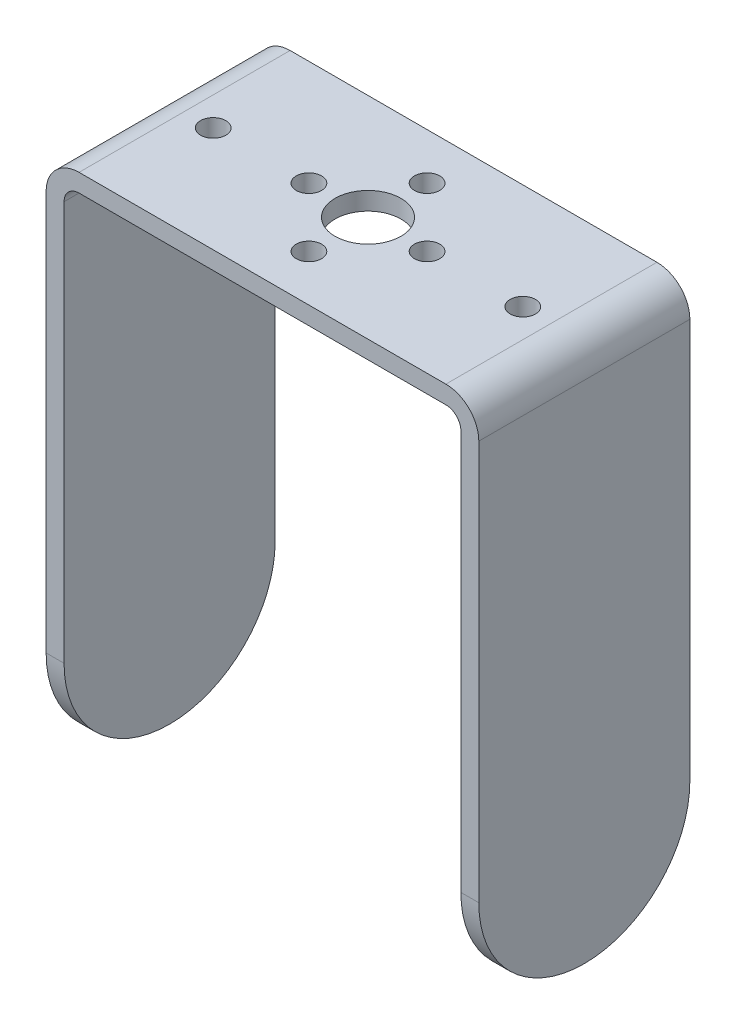
ISO-10303-21;
HEADER;
FILE_DESCRIPTION(('STEP AP214'),'2;1');
FILE_NAME('part.step','',(''),(''),'','','');
FILE_SCHEMA(('AUTOMOTIVE_DESIGN { 1 0 10303 214 1 1 1 1 }'));
ENDSEC;
DATA;
#1=APPLICATION_CONTEXT('core data for automotive mechanical design processes');
#2=APPLICATION_PROTOCOL_DEFINITION('international standard','automotive_design',2000,#1);
#3=PRODUCT_CONTEXT('',#1,'mechanical');
#4=PRODUCT('Part','Part','',(#3));
#5=PRODUCT_RELATED_PRODUCT_CATEGORY('part','',(#4));
#6=PRODUCT_DEFINITION_FORMATION('','',#4);
#7=PRODUCT_DEFINITION_CONTEXT('part definition',#1,'design');
#8=PRODUCT_DEFINITION('design','',#6,#7);
#9=PRODUCT_DEFINITION_SHAPE('','',#8);
#10=(LENGTH_UNIT() NAMED_UNIT(*) SI_UNIT(.MILLI.,.METRE.));
#11=(NAMED_UNIT(*) PLANE_ANGLE_UNIT() SI_UNIT($,.RADIAN.));
#12=(NAMED_UNIT(*) SI_UNIT($,.STERADIAN.) SOLID_ANGLE_UNIT());
#13=UNCERTAINTY_MEASURE_WITH_UNIT(LENGTH_MEASURE(1.E-05),#10,'distance_accuracy_value','');
#14=(GEOMETRIC_REPRESENTATION_CONTEXT(3) GLOBAL_UNCERTAINTY_ASSIGNED_CONTEXT((#13)) GLOBAL_UNIT_ASSIGNED_CONTEXT((#10,
#11,#12)) REPRESENTATION_CONTEXT('',''));
#15=CARTESIAN_POINT('',(0.,0.,0.));
#16=DIRECTION('',(0.,0.,1.));
#17=DIRECTION('',(1.,0.,0.));
#18=AXIS2_PLACEMENT_3D('',#15,#16,#17);
#19=CARTESIAN_POINT('',(23.876,-3.96240000000003,12.7));
#20=DIRECTION('',(1.,0.,0.));
#21=DIRECTION('',(0.,0.,-1.));
#22=AXIS2_PLACEMENT_3D('',#19,#20,#21);
#23=PLANE('',#22);
#24=DIRECTION('',(0.,1.,0.));
#25=VECTOR('',#24,1.);
#26=CARTESIAN_POINT('',(23.876,-3.96240000000003,-12.7));
#27=LINE('',#26,#25);
#28=CARTESIAN_POINT('',(23.876,-3.96240000000003,-12.7));
#29=VERTEX_POINT('',#28);
#30=CARTESIAN_POINT('',(23.876,-52.07,-12.7));
#31=VERTEX_POINT('',#30);
#32=EDGE_CURVE('E188',#29,#31,#27,.F.);
#33=ORIENTED_EDGE('',*,*,#32,.T.);
#34=CARTESIAN_POINT('',(23.876,-52.07,0.));
#35=DIRECTION('',(1.,0.,0.));
#36=DIRECTION('',(0.,0.,-1.));
#37=AXIS2_PLACEMENT_3D('',#34,#35,#36);
#38=CIRCLE('',#37,12.7);
#39=CARTESIAN_POINT('',(23.876,-64.77,0.));
#40=VERTEX_POINT('',#39);
#41=EDGE_CURVE('E235',#31,#40,#38,.F.);
#42=ORIENTED_EDGE('',*,*,#41,.T.);
#43=CARTESIAN_POINT('',(23.876,-52.07,0.));
#44=DIRECTION('',(1.,0.,0.));
#45=DIRECTION('',(0.,0.,-1.));
#46=AXIS2_PLACEMENT_3D('',#43,#44,#45);
#47=CIRCLE('',#46,12.7);
#48=CARTESIAN_POINT('',(23.876,-52.07,12.7));
#49=VERTEX_POINT('',#48);
#50=EDGE_CURVE('E233',#40,#49,#47,.F.);
#51=ORIENTED_EDGE('',*,*,#50,.T.);
#52=DIRECTION('',(0.,1.,0.));
#53=VECTOR('',#52,1.);
#54=CARTESIAN_POINT('',(23.876,-3.96240000000003,12.7));
#55=LINE('',#54,#53);
#56=CARTESIAN_POINT('',(23.876,-3.96240000000003,12.7));
#57=VERTEX_POINT('',#56);
#58=EDGE_CURVE('E166',#57,#49,#55,.F.);
#59=ORIENTED_EDGE('',*,*,#58,.F.);
#60=DIRECTION('',(0.,0.,-1.));
#61=VECTOR('',#60,1.);
#62=CARTESIAN_POINT('',(23.876,-3.96240000000003,12.7));
#63=LINE('',#62,#61);
#64=EDGE_CURVE('E187',#57,#29,#63,.T.);
#65=ORIENTED_EDGE('',*,*,#64,.T.);
#66=EDGE_LOOP('',(#33,#42,#51,#59,#65));
#67=FACE_BOUND('',#66,.T.);
#68=ADVANCED_FACE('F41',(#67),#23,.F.);
#69=CARTESIAN_POINT('',(26.035,-3.96240000000003,12.7));
#70=DIRECTION('',(1.,0.,0.));
#71=DIRECTION('',(0.,0.,-1.));
#72=AXIS2_PLACEMENT_3D('',#69,#70,#71);
#73=PLANE('',#72);
#74=CARTESIAN_POINT('',(26.035,-52.07,0.));
#75=DIRECTION('',(1.,0.,0.));
#76=DIRECTION('',(0.,0.,-1.));
#77=AXIS2_PLACEMENT_3D('',#74,#75,#76);
#78=CIRCLE('',#77,12.7);
#79=CARTESIAN_POINT('',(26.035,-52.07,12.7));
#80=VERTEX_POINT('',#79);
#81=CARTESIAN_POINT('',(26.035,-64.77,0.));
#82=VERTEX_POINT('',#81);
#83=EDGE_CURVE('E237',#80,#82,#78,.T.);
#84=ORIENTED_EDGE('',*,*,#83,.T.);
#85=CARTESIAN_POINT('',(26.035,-52.07,0.));
#86=DIRECTION('',(1.,0.,0.));
#87=DIRECTION('',(0.,0.,-1.));
#88=AXIS2_PLACEMENT_3D('',#85,#86,#87);
#89=CIRCLE('',#88,12.7);
#90=CARTESIAN_POINT('',(26.035,-52.07,-12.7));
#91=VERTEX_POINT('',#90);
#92=EDGE_CURVE('E239',#82,#91,#89,.T.);
#93=ORIENTED_EDGE('',*,*,#92,.T.);
#94=DIRECTION('',(0.,-1.,0.));
#95=VECTOR('',#94,1.);
#96=CARTESIAN_POINT('',(26.035,-3.96240000000003,-12.7));
#97=LINE('',#96,#95);
#98=CARTESIAN_POINT('',(26.035,-3.96240000000003,-12.7));
#99=VERTEX_POINT('',#98);
#100=EDGE_CURVE('E149',#99,#91,#97,.T.);
#101=ORIENTED_EDGE('',*,*,#100,.F.);
#102=DIRECTION('',(0.,0.,-1.));
#103=VECTOR('',#102,1.);
#104=CARTESIAN_POINT('',(26.035,-3.96240000000003,12.7));
#105=LINE('',#104,#103);
#106=CARTESIAN_POINT('',(26.035,-3.96240000000003,12.7));
#107=VERTEX_POINT('',#106);
#108=EDGE_CURVE('E143',#107,#99,#105,.T.);
#109=ORIENTED_EDGE('',*,*,#108,.F.);
#110=DIRECTION('',(0.,-1.,0.));
#111=VECTOR('',#110,1.);
#112=CARTESIAN_POINT('',(26.035,-3.96240000000003,12.7));
#113=LINE('',#112,#111);
#114=EDGE_CURVE('E146',#107,#80,#113,.T.);
#115=ORIENTED_EDGE('',*,*,#114,.T.);
#116=EDGE_LOOP('',(#84,#93,#101,#109,#115));
#117=FACE_BOUND('',#116,.T.);
#118=ADVANCED_FACE('F145',(#117),#73,.T.);
#119=CARTESIAN_POINT('',(22.0726,-3.9624,12.7));
#120=DIRECTION('',(0.,0.,-1.));
#121=DIRECTION('',(-1.,0.,0.));
#122=AXIS2_PLACEMENT_3D('',#119,#120,#121);
#123=CYLINDRICAL_SURFACE('',#122,3.9624);
#124=CARTESIAN_POINT('',(22.0726,-3.9624,-12.7));
#125=DIRECTION('',(0.,0.,-1.));
#126=DIRECTION('',(-1.,0.,0.));
#127=AXIS2_PLACEMENT_3D('',#124,#125,#126);
#128=CIRCLE('',#127,3.9624);
#129=CARTESIAN_POINT('',(22.0726,0.,-12.7));
#130=VERTEX_POINT('',#129);
#131=EDGE_CURVE('E193',#130,#99,#128,.T.);
#132=ORIENTED_EDGE('',*,*,#131,.F.);
#133=DIRECTION('',(0.,0.,-1.));
#134=VECTOR('',#133,1.);
#135=CARTESIAN_POINT('',(22.0726,0.,12.7));
#136=LINE('',#135,#134);
#137=CARTESIAN_POINT('',(22.0726,0.,12.7));
#138=VERTEX_POINT('',#137);
#139=EDGE_CURVE('E155',#138,#130,#136,.T.);
#140=ORIENTED_EDGE('',*,*,#139,.F.);
#141=CARTESIAN_POINT('',(22.0726,-3.9624,12.7));
#142=DIRECTION('',(0.,0.,-1.));
#143=DIRECTION('',(-1.,0.,0.));
#144=AXIS2_PLACEMENT_3D('',#141,#142,#143);
#145=CIRCLE('',#144,3.9624);
#146=EDGE_CURVE('E162',#138,#107,#145,.T.);
#147=ORIENTED_EDGE('',*,*,#146,.T.);
#148=ORIENTED_EDGE('',*,*,#108,.T.);
#149=EDGE_LOOP('',(#132,#140,#147,#148));
#150=FACE_BOUND('',#149,.T.);
#151=ADVANCED_FACE('F168',(#150),#123,.T.);
#152=CARTESIAN_POINT('',(-22.0726,0.,12.7));
#153=DIRECTION('',(0.,1.,0.));
#154=DIRECTION('',(0.,0.,1.));
#155=AXIS2_PLACEMENT_3D('',#152,#153,#154);
#156=PLANE('',#155);
#157=CARTESIAN_POINT('',(0.,0.,7.112));
#158=DIRECTION('',(0.,1.,0.));
#159=DIRECTION('',(0.,0.,1.));
#160=AXIS2_PLACEMENT_3D('',#157,#158,#159);
#161=CIRCLE('',#160,1.52399999999999);
#162=CARTESIAN_POINT('',(0.,0.,8.63599999999999));
#163=VERTEX_POINT('',#162);
#164=EDGE_CURVE('E282',#163,#163,#161,.T.);
#165=ORIENTED_EDGE('',*,*,#164,.F.);
#166=EDGE_LOOP('',(#165));
#167=FACE_BOUND('',#166,.T.);
#168=CARTESIAN_POINT('',(0.,0.,-7.112));
#169=DIRECTION('',(0.,1.,0.));
#170=DIRECTION('',(0.,0.,1.));
#171=AXIS2_PLACEMENT_3D('',#168,#169,#170);
#172=CIRCLE('',#171,1.52399999999999);
#173=CARTESIAN_POINT('',(0.,0.,-5.58800000000001));
#174=VERTEX_POINT('',#173);
#175=EDGE_CURVE('E271',#174,#174,#172,.T.);
#176=ORIENTED_EDGE('',*,*,#175,.F.);
#177=EDGE_LOOP('',(#176));
#178=FACE_BOUND('',#177,.T.);
#179=CARTESIAN_POINT('',(-7.112,0.,0.));
#180=DIRECTION('',(0.,1.,0.));
#181=DIRECTION('',(0.,0.,1.));
#182=AXIS2_PLACEMENT_3D('',#179,#180,#181);
#183=CIRCLE('',#182,1.52399999999999);
#184=CARTESIAN_POINT('',(-7.112,0.,1.52399999999999));
#185=VERTEX_POINT('',#184);
#186=EDGE_CURVE('E270',#185,#185,#183,.T.);
#187=ORIENTED_EDGE('',*,*,#186,.F.);
#188=EDGE_LOOP('',(#187));
#189=FACE_BOUND('',#188,.T.);
#190=CARTESIAN_POINT('',(7.112,0.,0.));
#191=DIRECTION('',(0.,1.,0.));
#192=DIRECTION('',(0.,0.,1.));
#193=AXIS2_PLACEMENT_3D('',#190,#191,#192);
#194=CIRCLE('',#193,1.52399999999999);
#195=CARTESIAN_POINT('',(7.112,0.,1.52399999999999));
#196=VERTEX_POINT('',#195);
#197=EDGE_CURVE('E267',#196,#196,#194,.T.);
#198=ORIENTED_EDGE('',*,*,#197,.F.);
#199=EDGE_LOOP('',(#198));
#200=FACE_BOUND('',#199,.T.);
#201=CARTESIAN_POINT('',(18.6309,0.,0.));
#202=DIRECTION('',(0.,1.,0.));
#203=DIRECTION('',(0.,0.,1.));
#204=AXIS2_PLACEMENT_3D('',#201,#202,#203);
#205=CIRCLE('',#204,1.52399999999999);
#206=CARTESIAN_POINT('',(18.6309,0.,1.52399999999999));
#207=VERTEX_POINT('',#206);
#208=EDGE_CURVE('E264',#207,#207,#205,.T.);
#209=ORIENTED_EDGE('',*,*,#208,.F.);
#210=EDGE_LOOP('',(#209));
#211=FACE_BOUND('',#210,.T.);
#212=CARTESIAN_POINT('',(-18.6309,0.,0.));
#213=DIRECTION('',(0.,1.,0.));
#214=DIRECTION('',(0.,0.,1.));
#215=AXIS2_PLACEMENT_3D('',#212,#213,#214);
#216=CIRCLE('',#215,1.52399999999999);
#217=CARTESIAN_POINT('',(-18.6309,0.,1.52399999999998));
#218=VERTEX_POINT('',#217);
#219=EDGE_CURVE('E260',#218,#218,#216,.T.);
#220=ORIENTED_EDGE('',*,*,#219,.F.);
#221=EDGE_LOOP('',(#220));
#222=FACE_BOUND('',#221,.T.);
#223=CARTESIAN_POINT('',(0.,0.,0.));
#224=DIRECTION('',(0.,1.,0.));
#225=DIRECTION('',(0.,0.,1.));
#226=AXIS2_PLACEMENT_3D('',#223,#224,#225);
#227=CIRCLE('',#226,3.9624);
#228=CARTESIAN_POINT('',(0.,0.,3.9624));
#229=VERTEX_POINT('',#228);
#230=EDGE_CURVE('E256',#229,#229,#227,.T.);
#231=ORIENTED_EDGE('',*,*,#230,.F.);
#232=EDGE_LOOP('',(#231));
#233=FACE_BOUND('',#232,.T.);
#234=DIRECTION('',(1.,0.,0.));
#235=VECTOR('',#234,1.);
#236=CARTESIAN_POINT('',(-22.0726,0.,-12.7));
#237=LINE('',#236,#235);
#238=CARTESIAN_POINT('',(-22.0726,0.,-12.7));
#239=VERTEX_POINT('',#238);
#240=EDGE_CURVE('E195',#239,#130,#237,.T.);
#241=ORIENTED_EDGE('',*,*,#240,.F.);
#242=DIRECTION('',(0.,0.,-1.));
#243=VECTOR('',#242,1.);
#244=CARTESIAN_POINT('',(-22.0726,0.,12.7));
#245=LINE('',#244,#243);
#246=CARTESIAN_POINT('',(-22.0726,0.,12.7));
#247=VERTEX_POINT('',#246);
#248=EDGE_CURVE('E225',#247,#239,#245,.T.);
#249=ORIENTED_EDGE('',*,*,#248,.F.);
#250=DIRECTION('',(1.,0.,0.));
#251=VECTOR('',#250,1.);
#252=CARTESIAN_POINT('',(-22.0726,0.,12.7));
#253=LINE('',#252,#251);
#254=EDGE_CURVE('E169',#247,#138,#253,.T.);
#255=ORIENTED_EDGE('',*,*,#254,.T.);
#256=ORIENTED_EDGE('',*,*,#139,.T.);
#257=EDGE_LOOP('',(#241,#249,#255,#256));
#258=FACE_BOUND('',#257,.T.);
#259=ADVANCED_FACE('F339',(#167,#178,#189,#200,#211,#222,#233,#258),#156,.T.);
#260=CARTESIAN_POINT('',(-22.0726,-3.9624,12.7));
#261=DIRECTION('',(0.,0.,-1.));
#262=DIRECTION('',(-1.,0.,0.));
#263=AXIS2_PLACEMENT_3D('',#260,#261,#262);
#264=CYLINDRICAL_SURFACE('',#263,3.9624);
#265=CARTESIAN_POINT('',(-22.0726,-3.9624,-12.7));
#266=DIRECTION('',(0.,0.,-1.));
#267=DIRECTION('',(-1.,0.,0.));
#268=AXIS2_PLACEMENT_3D('',#265,#266,#267);
#269=CIRCLE('',#268,3.9624);
#270=CARTESIAN_POINT('',(-26.035,-3.96240000000003,-12.7));
#271=VERTEX_POINT('',#270);
#272=EDGE_CURVE('E198',#271,#239,#269,.T.);
#273=ORIENTED_EDGE('',*,*,#272,.F.);
#274=DIRECTION('',(0.,0.,-1.));
#275=VECTOR('',#274,1.);
#276=CARTESIAN_POINT('',(-26.035,-3.96240000000003,12.7));
#277=LINE('',#276,#275);
#278=CARTESIAN_POINT('',(-26.035,-3.96240000000003,12.7));
#279=VERTEX_POINT('',#278);
#280=EDGE_CURVE('E222',#279,#271,#277,.T.);
#281=ORIENTED_EDGE('',*,*,#280,.F.);
#282=CARTESIAN_POINT('',(-22.0726,-3.9624,12.7));
#283=DIRECTION('',(0.,0.,-1.));
#284=DIRECTION('',(-1.,0.,0.));
#285=AXIS2_PLACEMENT_3D('',#282,#283,#284);
#286=CIRCLE('',#285,3.9624);
#287=EDGE_CURVE('E171',#279,#247,#286,.T.);
#288=ORIENTED_EDGE('',*,*,#287,.T.);
#289=ORIENTED_EDGE('',*,*,#248,.T.);
#290=EDGE_LOOP('',(#273,#281,#288,#289));
#291=FACE_BOUND('',#290,.T.);
#292=ADVANCED_FACE('F336',(#291),#264,.T.);
#293=CARTESIAN_POINT('',(-26.035,-64.77,12.7));
#294=DIRECTION('',(-1.,0.,0.));
#295=DIRECTION('',(0.,0.,1.));
#296=AXIS2_PLACEMENT_3D('',#293,#294,#295);
#297=PLANE('',#296);
#298=DIRECTION('',(0.,1.,0.));
#299=VECTOR('',#298,1.);
#300=CARTESIAN_POINT('',(-26.035,-64.77,-12.7));
#301=LINE('',#300,#299);
#302=CARTESIAN_POINT('',(-26.035,-52.07,-12.7));
#303=VERTEX_POINT('',#302);
#304=EDGE_CURVE('E201',#303,#271,#301,.T.);
#305=ORIENTED_EDGE('',*,*,#304,.F.);
#306=CARTESIAN_POINT('',(-26.035,-52.07,0.));
#307=DIRECTION('',(-1.,0.,0.));
#308=DIRECTION('',(0.,0.,1.));
#309=AXIS2_PLACEMENT_3D('',#306,#307,#308);
#310=CIRCLE('',#309,12.7);
#311=CARTESIAN_POINT('',(-26.035,-64.77,0.));
#312=VERTEX_POINT('',#311);
#313=EDGE_CURVE('E64',#303,#312,#310,.T.);
#314=ORIENTED_EDGE('',*,*,#313,.T.);
#315=CARTESIAN_POINT('',(-26.035,-52.07,0.));
#316=DIRECTION('',(-1.,0.,0.));
#317=DIRECTION('',(0.,0.,1.));
#318=AXIS2_PLACEMENT_3D('',#315,#316,#317);
#319=CIRCLE('',#318,12.7);
#320=CARTESIAN_POINT('',(-26.035,-52.07,12.7));
#321=VERTEX_POINT('',#320);
#322=EDGE_CURVE('E244',#312,#321,#319,.T.);
#323=ORIENTED_EDGE('',*,*,#322,.T.);
#324=DIRECTION('',(0.,1.,0.));
#325=VECTOR('',#324,1.);
#326=CARTESIAN_POINT('',(-26.035,-64.77,12.7));
#327=LINE('',#326,#325);
#328=EDGE_CURVE('E177',#321,#279,#327,.T.);
#329=ORIENTED_EDGE('',*,*,#328,.T.);
#330=ORIENTED_EDGE('',*,*,#280,.T.);
#331=EDGE_LOOP('',(#305,#314,#323,#329,#330));
#332=FACE_BOUND('',#331,.T.);
#333=ADVANCED_FACE('F331',(#332),#297,.T.);
#334=CARTESIAN_POINT('',(-23.876,-64.77,12.7));
#335=DIRECTION('',(-1.,0.,0.));
#336=DIRECTION('',(0.,0.,1.));
#337=AXIS2_PLACEMENT_3D('',#334,#335,#336);
#338=PLANE('',#337);
#339=CARTESIAN_POINT('',(-23.876,-52.07,0.));
#340=DIRECTION('',(-1.,0.,0.));
#341=DIRECTION('',(0.,0.,1.));
#342=AXIS2_PLACEMENT_3D('',#339,#340,#341);
#343=CIRCLE('',#342,12.7);
#344=CARTESIAN_POINT('',(-23.876,-52.07,12.7));
#345=VERTEX_POINT('',#344);
#346=CARTESIAN_POINT('',(-23.876,-64.77,0.));
#347=VERTEX_POINT('',#346);
#348=EDGE_CURVE('E50',#345,#347,#343,.F.);
#349=ORIENTED_EDGE('',*,*,#348,.T.);
#350=CARTESIAN_POINT('',(-23.876,-52.07,0.));
#351=DIRECTION('',(-1.,0.,0.));
#352=DIRECTION('',(0.,0.,1.));
#353=AXIS2_PLACEMENT_3D('',#350,#351,#352);
#354=CIRCLE('',#353,12.7);
#355=CARTESIAN_POINT('',(-23.876,-52.07,-12.7));
#356=VERTEX_POINT('',#355);
#357=EDGE_CURVE('E11',#347,#356,#354,.F.);
#358=ORIENTED_EDGE('',*,*,#357,.T.);
#359=DIRECTION('',(0.,1.,0.));
#360=VECTOR('',#359,1.);
#361=CARTESIAN_POINT('',(-23.876,-64.77,-12.7));
#362=LINE('',#361,#360);
#363=CARTESIAN_POINT('',(-23.876,-3.96240000000001,-12.7));
#364=VERTEX_POINT('',#363);
#365=EDGE_CURVE('E203',#356,#364,#362,.T.);
#366=ORIENTED_EDGE('',*,*,#365,.T.);
#367=DIRECTION('',(0.,0.,-1.));
#368=VECTOR('',#367,1.);
#369=CARTESIAN_POINT('',(-23.876,-3.96240000000001,12.7));
#370=LINE('',#369,#368);
#371=CARTESIAN_POINT('',(-23.876,-3.96240000000001,12.7));
#372=VERTEX_POINT('',#371);
#373=EDGE_CURVE('E219',#372,#364,#370,.T.);
#374=ORIENTED_EDGE('',*,*,#373,.F.);
#375=DIRECTION('',(0.,1.,0.));
#376=VECTOR('',#375,1.);
#377=CARTESIAN_POINT('',(-23.876,-64.77,12.7));
#378=LINE('',#377,#376);
#379=EDGE_CURVE('E179',#345,#372,#378,.T.);
#380=ORIENTED_EDGE('',*,*,#379,.F.);
#381=EDGE_LOOP('',(#349,#358,#366,#374,#380));
#382=FACE_BOUND('',#381,.T.);
#383=ADVANCED_FACE('F413',(#382),#338,.F.);
#384=CARTESIAN_POINT('',(-22.0726,-3.9624,12.7));
#385=DIRECTION('',(0.,0.,-1.));
#386=DIRECTION('',(-1.,0.,0.));
#387=AXIS2_PLACEMENT_3D('',#384,#385,#386);
#388=CYLINDRICAL_SURFACE('',#387,1.8034);
#389=CARTESIAN_POINT('',(-22.0726,-3.9624,-12.7));
#390=DIRECTION('',(0.,0.,1.));
#391=DIRECTION('',(1.,0.,0.));
#392=AXIS2_PLACEMENT_3D('',#389,#390,#391);
#393=CIRCLE('',#392,1.8034);
#394=CARTESIAN_POINT('',(-22.0726,-2.159,-12.7));
#395=VERTEX_POINT('',#394);
#396=EDGE_CURVE('E205',#364,#395,#393,.F.);
#397=ORIENTED_EDGE('',*,*,#396,.T.);
#398=DIRECTION('',(0.,0.,-1.));
#399=VECTOR('',#398,1.);
#400=CARTESIAN_POINT('',(-22.0726,-2.159,12.7));
#401=LINE('',#400,#399);
#402=CARTESIAN_POINT('',(-22.0726,-2.159,12.7));
#403=VERTEX_POINT('',#402);
#404=EDGE_CURVE('E216',#403,#395,#401,.T.);
#405=ORIENTED_EDGE('',*,*,#404,.F.);
#406=CARTESIAN_POINT('',(-22.0726,-3.9624,12.7));
#407=DIRECTION('',(0.,0.,1.));
#408=DIRECTION('',(1.,0.,0.));
#409=AXIS2_PLACEMENT_3D('',#406,#407,#408);
#410=CIRCLE('',#409,1.8034);
#411=EDGE_CURVE('E181',#372,#403,#410,.F.);
#412=ORIENTED_EDGE('',*,*,#411,.F.);
#413=ORIENTED_EDGE('',*,*,#373,.T.);
#414=EDGE_LOOP('',(#397,#405,#412,#413));
#415=FACE_BOUND('',#414,.T.);
#416=ADVANCED_FACE('F321',(#415),#388,.F.);
#417=CARTESIAN_POINT('',(-22.0726,-2.159,12.7));
#418=DIRECTION('',(0.,1.,0.));
#419=DIRECTION('',(0.,0.,1.));
#420=AXIS2_PLACEMENT_3D('',#417,#418,#419);
#421=PLANE('',#420);
#422=CARTESIAN_POINT('',(0.,-2.159,7.112));
#423=DIRECTION('',(0.,1.,0.));
#424=DIRECTION('',(0.,0.,1.));
#425=AXIS2_PLACEMENT_3D('',#422,#423,#424);
#426=CIRCLE('',#425,1.52399999999998);
#427=CARTESIAN_POINT('',(0.,-2.159,8.63599999999998));
#428=VERTEX_POINT('',#427);
#429=EDGE_CURVE('E45',#428,#428,#426,.T.);
#430=ORIENTED_EDGE('',*,*,#429,.T.);
#431=EDGE_LOOP('',(#430));
#432=FACE_BOUND('',#431,.T.);
#433=CARTESIAN_POINT('',(0.,-2.159,-7.112));
#434=DIRECTION('',(0.,1.,0.));
#435=DIRECTION('',(0.,0.,1.));
#436=AXIS2_PLACEMENT_3D('',#433,#434,#435);
#437=CIRCLE('',#436,1.52399999999998);
#438=CARTESIAN_POINT('',(0.,-2.159,-5.58800000000002));
#439=VERTEX_POINT('',#438);
#440=EDGE_CURVE('E268',#439,#439,#437,.T.);
#441=ORIENTED_EDGE('',*,*,#440,.T.);
#442=EDGE_LOOP('',(#441));
#443=FACE_BOUND('',#442,.T.);
#444=CARTESIAN_POINT('',(-7.112,-2.159,0.));
#445=DIRECTION('',(0.,1.,0.));
#446=DIRECTION('',(0.,0.,1.));
#447=AXIS2_PLACEMENT_3D('',#444,#445,#446);
#448=CIRCLE('',#447,1.52399999999998);
#449=CARTESIAN_POINT('',(-7.112,-2.159,1.52399999999998));
#450=VERTEX_POINT('',#449);
#451=EDGE_CURVE('E275',#450,#450,#448,.T.);
#452=ORIENTED_EDGE('',*,*,#451,.T.);
#453=EDGE_LOOP('',(#452));
#454=FACE_BOUND('',#453,.T.);
#455=CARTESIAN_POINT('',(7.112,-2.159,0.));
#456=DIRECTION('',(0.,1.,0.));
#457=DIRECTION('',(0.,0.,1.));
#458=AXIS2_PLACEMENT_3D('',#455,#456,#457);
#459=CIRCLE('',#458,1.52399999999998);
#460=CARTESIAN_POINT('',(7.112,-2.159,1.52399999999998));
#461=VERTEX_POINT('',#460);
#462=EDGE_CURVE('E265',#461,#461,#459,.T.);
#463=ORIENTED_EDGE('',*,*,#462,.T.);
#464=EDGE_LOOP('',(#463));
#465=FACE_BOUND('',#464,.T.);
#466=CARTESIAN_POINT('',(18.6309,-2.159,0.));
#467=DIRECTION('',(0.,1.,0.));
#468=DIRECTION('',(0.,0.,1.));
#469=AXIS2_PLACEMENT_3D('',#466,#467,#468);
#470=CIRCLE('',#469,1.52399999999998);
#471=CARTESIAN_POINT('',(18.6309,-2.159,1.52399999999999));
#472=VERTEX_POINT('',#471);
#473=EDGE_CURVE('E261',#472,#472,#470,.T.);
#474=ORIENTED_EDGE('',*,*,#473,.T.);
#475=EDGE_LOOP('',(#474));
#476=FACE_BOUND('',#475,.T.);
#477=CARTESIAN_POINT('',(-18.6309,-2.159,0.));
#478=DIRECTION('',(0.,1.,0.));
#479=DIRECTION('',(0.,0.,1.));
#480=AXIS2_PLACEMENT_3D('',#477,#478,#479);
#481=CIRCLE('',#480,1.52399999999998);
#482=CARTESIAN_POINT('',(-18.6309,-2.159,1.52399999999998));
#483=VERTEX_POINT('',#482);
#484=EDGE_CURVE('E257',#483,#483,#481,.T.);
#485=ORIENTED_EDGE('',*,*,#484,.T.);
#486=EDGE_LOOP('',(#485));
#487=FACE_BOUND('',#486,.T.);
#488=CARTESIAN_POINT('',(0.,-2.15899999999999,0.));
#489=DIRECTION('',(0.,1.,0.));
#490=DIRECTION('',(0.,0.,1.));
#491=AXIS2_PLACEMENT_3D('',#488,#489,#490);
#492=CIRCLE('',#491,3.9624);
#493=CARTESIAN_POINT('',(0.,-2.15899999999999,3.9624));
#494=VERTEX_POINT('',#493);
#495=EDGE_CURVE('E253',#494,#494,#492,.T.);
#496=ORIENTED_EDGE('',*,*,#495,.T.);
#497=EDGE_LOOP('',(#496));
#498=FACE_BOUND('',#497,.T.);
#499=DIRECTION('',(1.,0.,0.));
#500=VECTOR('',#499,1.);
#501=CARTESIAN_POINT('',(-22.0726,-2.159,-12.7));
#502=LINE('',#501,#500);
#503=CARTESIAN_POINT('',(22.0726,-2.159,-12.7));
#504=VERTEX_POINT('',#503);
#505=EDGE_CURVE('E207',#395,#504,#502,.T.);
#506=ORIENTED_EDGE('',*,*,#505,.T.);
#507=DIRECTION('',(0.,0.,-1.));
#508=VECTOR('',#507,1.);
#509=CARTESIAN_POINT('',(22.0726,-2.159,12.7));
#510=LINE('',#509,#508);
#511=CARTESIAN_POINT('',(22.0726,-2.159,12.7));
#512=VERTEX_POINT('',#511);
#513=EDGE_CURVE('E213',#512,#504,#510,.T.);
#514=ORIENTED_EDGE('',*,*,#513,.F.);
#515=DIRECTION('',(1.,0.,0.));
#516=VECTOR('',#515,1.);
#517=CARTESIAN_POINT('',(-22.0726,-2.159,12.7));
#518=LINE('',#517,#516);
#519=EDGE_CURVE('E183',#403,#512,#518,.T.);
#520=ORIENTED_EDGE('',*,*,#519,.F.);
#521=ORIENTED_EDGE('',*,*,#404,.T.);
#522=EDGE_LOOP('',(#506,#514,#520,#521));
#523=FACE_BOUND('',#522,.T.);
#524=ADVANCED_FACE('F317',(#432,#443,#454,#465,#476,#487,#498,#523),#421,.F.);
#525=CARTESIAN_POINT('',(22.0726,-3.9624,12.7));
#526=DIRECTION('',(0.,0.,-1.));
#527=DIRECTION('',(-1.,0.,0.));
#528=AXIS2_PLACEMENT_3D('',#525,#526,#527);
#529=CYLINDRICAL_SURFACE('',#528,1.8034);
#530=CARTESIAN_POINT('',(22.0726,-3.9624,-12.7));
#531=DIRECTION('',(0.,0.,1.));
#532=DIRECTION('',(1.,0.,0.));
#533=AXIS2_PLACEMENT_3D('',#530,#531,#532);
#534=CIRCLE('',#533,1.8034);
#535=EDGE_CURVE('E209',#504,#29,#534,.F.);
#536=ORIENTED_EDGE('',*,*,#535,.T.);
#537=ORIENTED_EDGE('',*,*,#64,.F.);
#538=CARTESIAN_POINT('',(22.0726,-3.9624,12.7));
#539=DIRECTION('',(0.,0.,1.));
#540=DIRECTION('',(1.,0.,0.));
#541=AXIS2_PLACEMENT_3D('',#538,#539,#540);
#542=CIRCLE('',#541,1.8034);
#543=EDGE_CURVE('E185',#512,#57,#542,.F.);
#544=ORIENTED_EDGE('',*,*,#543,.F.);
#545=ORIENTED_EDGE('',*,*,#513,.T.);
#546=EDGE_LOOP('',(#536,#537,#544,#545));
#547=FACE_BOUND('',#546,.T.);
#548=ADVANCED_FACE('F313',(#547),#529,.F.);
#549=CARTESIAN_POINT('',(22.0726,-3.9624,12.7));
#550=DIRECTION('',(0.,0.,-1.));
#551=DIRECTION('',(-1.,0.,0.));
#552=AXIS2_PLACEMENT_3D('',#549,#550,#551);
#553=PLANE('',#552);
#554=ORIENTED_EDGE('',*,*,#58,.T.);
#555=DIRECTION('',(-1.,0.,0.));
#556=VECTOR('',#555,1.);
#557=CARTESIAN_POINT('',(26.035,-52.07,12.7));
#558=LINE('',#557,#556);
#559=EDGE_CURVE('E165',#49,#80,#558,.F.);
#560=ORIENTED_EDGE('',*,*,#559,.T.);
#561=ORIENTED_EDGE('',*,*,#114,.F.);
#562=ORIENTED_EDGE('',*,*,#146,.F.);
#563=ORIENTED_EDGE('',*,*,#254,.F.);
#564=ORIENTED_EDGE('',*,*,#287,.F.);
#565=ORIENTED_EDGE('',*,*,#328,.F.);
#566=DIRECTION('',(-1.,0.,0.));
#567=VECTOR('',#566,1.);
#568=CARTESIAN_POINT('',(-23.876,-52.07,12.7));
#569=LINE('',#568,#567);
#570=EDGE_CURVE('E241',#321,#345,#569,.F.);
#571=ORIENTED_EDGE('',*,*,#570,.T.);
#572=ORIENTED_EDGE('',*,*,#379,.T.);
#573=ORIENTED_EDGE('',*,*,#411,.T.);
#574=ORIENTED_EDGE('',*,*,#519,.T.);
#575=ORIENTED_EDGE('',*,*,#543,.T.);
#576=EDGE_LOOP('',(#554,#560,#561,#562,#563,#564,#565,#571,#572,#573,#574,#575));
#577=FACE_BOUND('',#576,.T.);
#578=ADVANCED_FACE('F160',(#577),#553,.F.);
#579=CARTESIAN_POINT('',(22.0726,-3.9624,-12.7));
#580=DIRECTION('',(0.,0.,-1.));
#581=DIRECTION('',(-1.,0.,0.));
#582=AXIS2_PLACEMENT_3D('',#579,#580,#581);
#583=PLANE('',#582);
#584=ORIENTED_EDGE('',*,*,#100,.T.);
#585=DIRECTION('',(-1.,0.,0.));
#586=VECTOR('',#585,1.);
#587=CARTESIAN_POINT('',(22.0726,-52.07,-12.7));
#588=LINE('',#587,#586);
#589=EDGE_CURVE('E230',#91,#31,#588,.T.);
#590=ORIENTED_EDGE('',*,*,#589,.T.);
#591=ORIENTED_EDGE('',*,*,#32,.F.);
#592=ORIENTED_EDGE('',*,*,#535,.F.);
#593=ORIENTED_EDGE('',*,*,#505,.F.);
#594=ORIENTED_EDGE('',*,*,#396,.F.);
#595=ORIENTED_EDGE('',*,*,#365,.F.);
#596=DIRECTION('',(-1.,0.,0.));
#597=VECTOR('',#596,1.);
#598=CARTESIAN_POINT('',(22.0726,-52.07,-12.7));
#599=LINE('',#598,#597);
#600=EDGE_CURVE('E154',#356,#303,#599,.T.);
#601=ORIENTED_EDGE('',*,*,#600,.T.);
#602=ORIENTED_EDGE('',*,*,#304,.T.);
#603=ORIENTED_EDGE('',*,*,#272,.T.);
#604=ORIENTED_EDGE('',*,*,#240,.T.);
#605=ORIENTED_EDGE('',*,*,#131,.T.);
#606=EDGE_LOOP('',(#584,#590,#591,#592,#593,#594,#595,#601,#602,#603,#604,#605));
#607=FACE_BOUND('',#606,.T.);
#608=ADVANCED_FACE('F306',(#607),#583,.T.);
#609=CARTESIAN_POINT('',(26.035,-52.07,0.));
#610=DIRECTION('',(1.,0.,0.));
#611=DIRECTION('',(0.,0.,-1.));
#612=AXIS2_PLACEMENT_3D('',#609,#610,#611);
#613=CYLINDRICAL_SURFACE('',#612,12.7);
#614=DIRECTION('',(-1.,0.,0.));
#615=VECTOR('',#614,1.);
#616=CARTESIAN_POINT('',(23.876,-64.77,0.));
#617=LINE('',#616,#615);
#618=EDGE_CURVE('E191',#82,#40,#617,.T.);
#619=ORIENTED_EDGE('',*,*,#618,.F.);
#620=ORIENTED_EDGE('',*,*,#83,.F.);
#621=ORIENTED_EDGE('',*,*,#559,.F.);
#622=ORIENTED_EDGE('',*,*,#50,.F.);
#623=EDGE_LOOP('',(#619,#620,#621,#622));
#624=FACE_BOUND('',#623,.T.);
#625=ADVANCED_FACE('F301',(#624),#613,.T.);
#626=CARTESIAN_POINT('',(22.0726,-52.07,0.));
#627=DIRECTION('',(-1.,0.,0.));
#628=DIRECTION('',(0.,0.,1.));
#629=AXIS2_PLACEMENT_3D('',#626,#627,#628);
#630=CYLINDRICAL_SURFACE('',#629,12.7);
#631=ORIENTED_EDGE('',*,*,#92,.F.);
#632=ORIENTED_EDGE('',*,*,#618,.T.);
#633=ORIENTED_EDGE('',*,*,#41,.F.);
#634=ORIENTED_EDGE('',*,*,#589,.F.);
#635=EDGE_LOOP('',(#631,#632,#633,#634));
#636=FACE_BOUND('',#635,.T.);
#637=ADVANCED_FACE('F308',(#636),#630,.T.);
#638=CARTESIAN_POINT('',(-23.876,-52.07,0.));
#639=DIRECTION('',(1.,0.,0.));
#640=DIRECTION('',(0.,0.,-1.));
#641=AXIS2_PLACEMENT_3D('',#638,#639,#640);
#642=CYLINDRICAL_SURFACE('',#641,12.7);
#643=DIRECTION('',(-1.,0.,0.));
#644=VECTOR('',#643,1.);
#645=CARTESIAN_POINT('',(-26.035,-64.77,0.));
#646=LINE('',#645,#644);
#647=EDGE_CURVE('E250',#347,#312,#646,.T.);
#648=ORIENTED_EDGE('',*,*,#647,.F.);
#649=ORIENTED_EDGE('',*,*,#348,.F.);
#650=ORIENTED_EDGE('',*,*,#570,.F.);
#651=ORIENTED_EDGE('',*,*,#322,.F.);
#652=EDGE_LOOP('',(#648,#649,#650,#651));
#653=FACE_BOUND('',#652,.T.);
#654=ADVANCED_FACE('F43',(#653),#642,.T.);
#655=CARTESIAN_POINT('',(22.0726,-52.07,0.));
#656=DIRECTION('',(-1.,0.,0.));
#657=DIRECTION('',(0.,0.,1.));
#658=AXIS2_PLACEMENT_3D('',#655,#656,#657);
#659=CYLINDRICAL_SURFACE('',#658,12.7);
#660=ORIENTED_EDGE('',*,*,#357,.F.);
#661=ORIENTED_EDGE('',*,*,#647,.T.);
#662=ORIENTED_EDGE('',*,*,#313,.F.);
#663=ORIENTED_EDGE('',*,*,#600,.F.);
#664=EDGE_LOOP('',(#660,#661,#662,#663));
#665=FACE_BOUND('',#664,.T.);
#666=ADVANCED_FACE('F327',(#665),#659,.T.);
#667=CARTESIAN_POINT('',(0.,-64.77,0.));
#668=DIRECTION('',(0.,1.,0.));
#669=DIRECTION('',(0.,0.,1.));
#670=AXIS2_PLACEMENT_3D('',#667,#668,#669);
#671=CYLINDRICAL_SURFACE('',#670,3.9624);
#672=ORIENTED_EDGE('',*,*,#230,.T.);
#673=EDGE_LOOP('',(#672));
#674=FACE_BOUND('',#673,.T.);
#675=ORIENTED_EDGE('',*,*,#495,.F.);
#676=EDGE_LOOP('',(#675));
#677=FACE_BOUND('',#676,.T.);
#678=ADVANCED_FACE('F362',(#674,#677),#671,.F.);
#679=CARTESIAN_POINT('',(-18.6309,0.,0.));
#680=DIRECTION('',(0.,1.,0.));
#681=DIRECTION('',(0.,0.,1.));
#682=AXIS2_PLACEMENT_3D('',#679,#680,#681);
#683=CYLINDRICAL_SURFACE('',#682,1.52399999999998);
#684=ORIENTED_EDGE('',*,*,#219,.T.);
#685=EDGE_LOOP('',(#684));
#686=FACE_BOUND('',#685,.T.);
#687=ORIENTED_EDGE('',*,*,#484,.F.);
#688=EDGE_LOOP('',(#687));
#689=FACE_BOUND('',#688,.T.);
#690=ADVANCED_FACE('F367',(#686,#689),#683,.F.);
#691=CARTESIAN_POINT('',(18.6309,0.,0.));
#692=DIRECTION('',(0.,1.,0.));
#693=DIRECTION('',(0.,0.,1.));
#694=AXIS2_PLACEMENT_3D('',#691,#692,#693);
#695=CYLINDRICAL_SURFACE('',#694,1.52399999999998);
#696=ORIENTED_EDGE('',*,*,#208,.T.);
#697=EDGE_LOOP('',(#696));
#698=FACE_BOUND('',#697,.T.);
#699=ORIENTED_EDGE('',*,*,#473,.F.);
#700=EDGE_LOOP('',(#699));
#701=FACE_BOUND('',#700,.T.);
#702=ADVANCED_FACE('F487',(#698,#701),#695,.F.);
#703=CARTESIAN_POINT('',(7.112,0.,0.));
#704=DIRECTION('',(0.,1.,0.));
#705=DIRECTION('',(0.,0.,1.));
#706=AXIS2_PLACEMENT_3D('',#703,#704,#705);
#707=CYLINDRICAL_SURFACE('',#706,1.52399999999998);
#708=ORIENTED_EDGE('',*,*,#197,.T.);
#709=EDGE_LOOP('',(#708));
#710=FACE_BOUND('',#709,.T.);
#711=ORIENTED_EDGE('',*,*,#462,.F.);
#712=EDGE_LOOP('',(#711));
#713=FACE_BOUND('',#712,.T.);
#714=ADVANCED_FACE('F494',(#710,#713),#707,.F.);
#715=CARTESIAN_POINT('',(-7.112,0.,0.));
#716=DIRECTION('',(0.,1.,0.));
#717=DIRECTION('',(0.,0.,1.));
#718=AXIS2_PLACEMENT_3D('',#715,#716,#717);
#719=CYLINDRICAL_SURFACE('',#718,1.52399999999998);
#720=ORIENTED_EDGE('',*,*,#186,.T.);
#721=EDGE_LOOP('',(#720));
#722=FACE_BOUND('',#721,.T.);
#723=ORIENTED_EDGE('',*,*,#451,.F.);
#724=EDGE_LOOP('',(#723));
#725=FACE_BOUND('',#724,.T.);
#726=ADVANCED_FACE('F502',(#722,#725),#719,.F.);
#727=CARTESIAN_POINT('',(0.,0.,-7.112));
#728=DIRECTION('',(0.,1.,0.));
#729=DIRECTION('',(0.,0.,1.));
#730=AXIS2_PLACEMENT_3D('',#727,#728,#729);
#731=CYLINDRICAL_SURFACE('',#730,1.52399999999998);
#732=ORIENTED_EDGE('',*,*,#175,.T.);
#733=EDGE_LOOP('',(#732));
#734=FACE_BOUND('',#733,.T.);
#735=ORIENTED_EDGE('',*,*,#440,.F.);
#736=EDGE_LOOP('',(#735));
#737=FACE_BOUND('',#736,.T.);
#738=ADVANCED_FACE('F510',(#734,#737),#731,.F.);
#739=CARTESIAN_POINT('',(0.,0.,7.112));
#740=DIRECTION('',(0.,1.,0.));
#741=DIRECTION('',(0.,0.,1.));
#742=AXIS2_PLACEMENT_3D('',#739,#740,#741);
#743=CYLINDRICAL_SURFACE('',#742,1.52399999999998);
#744=ORIENTED_EDGE('',*,*,#164,.T.);
#745=EDGE_LOOP('',(#744));
#746=FACE_BOUND('',#745,.T.);
#747=ORIENTED_EDGE('',*,*,#429,.F.);
#748=EDGE_LOOP('',(#747));
#749=FACE_BOUND('',#748,.T.);
#750=ADVANCED_FACE('F518',(#746,#749),#743,.F.);
#751=CLOSED_SHELL('',(#68,#118,#151,#259,#292,#333,#383,#416,#524,#548,#578,#608,#625,#637,#654,
#666,#678,#690,#702,#714,#726,#738,#750));
#752=MANIFOLD_SOLID_BREP('B2',#751);
#753=ADVANCED_BREP_SHAPE_REPRESENTATION('',(#18,#752),#14);
#754=SHAPE_DEFINITION_REPRESENTATION(#9,#753);
ENDSEC;
END-ISO-10303-21;
